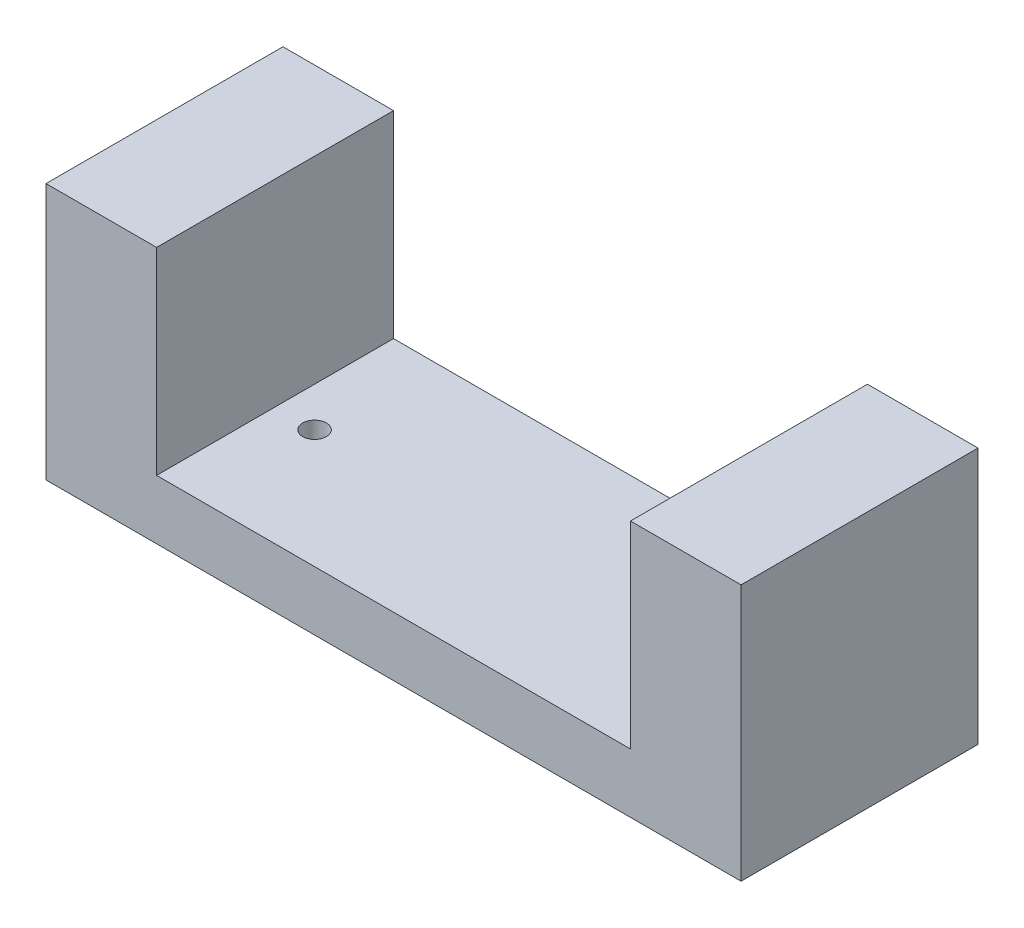
ISO-10303-21;
HEADER;
FILE_DESCRIPTION(('STEP AP214'),'2;1');
FILE_NAME('part.step','',(''),(''),'','','');
FILE_SCHEMA(('AUTOMOTIVE_DESIGN { 1 0 10303 214 1 1 1 1 }'));
ENDSEC;
DATA;
#1=APPLICATION_CONTEXT('core data for automotive mechanical design processes');
#2=APPLICATION_PROTOCOL_DEFINITION('international standard','automotive_design',2000,#1);
#3=PRODUCT_CONTEXT('',#1,'mechanical');
#4=PRODUCT('Part','Part','',(#3));
#5=PRODUCT_RELATED_PRODUCT_CATEGORY('part','',(#4));
#6=PRODUCT_DEFINITION_FORMATION('','',#4);
#7=PRODUCT_DEFINITION_CONTEXT('part definition',#1,'design');
#8=PRODUCT_DEFINITION('design','',#6,#7);
#9=PRODUCT_DEFINITION_SHAPE('','',#8);
#10=(LENGTH_UNIT() NAMED_UNIT(*) SI_UNIT(.MILLI.,.METRE.));
#11=(NAMED_UNIT(*) PLANE_ANGLE_UNIT() SI_UNIT($,.RADIAN.));
#12=(NAMED_UNIT(*) SI_UNIT($,.STERADIAN.) SOLID_ANGLE_UNIT());
#13=UNCERTAINTY_MEASURE_WITH_UNIT(LENGTH_MEASURE(1.E-05),#10,'distance_accuracy_value','');
#14=(GEOMETRIC_REPRESENTATION_CONTEXT(3) GLOBAL_UNCERTAINTY_ASSIGNED_CONTEXT((#13)) GLOBAL_UNIT_ASSIGNED_CONTEXT((#10,
#11,#12)) REPRESENTATION_CONTEXT('',''));
#15=CARTESIAN_POINT('',(0.,0.,0.));
#16=DIRECTION('',(0.,0.,1.));
#17=DIRECTION('',(1.,0.,0.));
#18=AXIS2_PLACEMENT_3D('',#15,#16,#17);
#19=CARTESIAN_POINT('',(0.,32.5,0.));
#20=DIRECTION('',(0.,-1.,0.));
#21=DIRECTION('',(0.,0.,-1.));
#22=AXIS2_PLACEMENT_3D('',#19,#20,#21);
#23=PLANE('',#22);
#24=DIRECTION('',(-1.,0.,0.));
#25=VECTOR('',#24,1.);
#26=CARTESIAN_POINT('',(-44.,32.5,-15.));
#27=LINE('',#26,#25);
#28=CARTESIAN_POINT('',(44.,32.5,-15.));
#29=VERTEX_POINT('',#28);
#30=CARTESIAN_POINT('',(30.,32.5,-15.));
#31=VERTEX_POINT('',#30);
#32=EDGE_CURVE('E89',#29,#31,#27,.T.);
#33=ORIENTED_EDGE('',*,*,#32,.T.);
#34=DIRECTION('',(0.,0.,-1.));
#35=VECTOR('',#34,1.);
#36=CARTESIAN_POINT('',(30.,32.5,15.));
#37=LINE('',#36,#35);
#38=CARTESIAN_POINT('',(30.,32.5,15.));
#39=VERTEX_POINT('',#38);
#40=EDGE_CURVE('E115',#39,#31,#37,.T.);
#41=ORIENTED_EDGE('',*,*,#40,.F.);
#42=DIRECTION('',(1.,0.,0.));
#43=VECTOR('',#42,1.);
#44=CARTESIAN_POINT('',(-44.,32.5,15.));
#45=LINE('',#44,#43);
#46=CARTESIAN_POINT('',(44.,32.5,15.));
#47=VERTEX_POINT('',#46);
#48=EDGE_CURVE('E60',#39,#47,#45,.T.);
#49=ORIENTED_EDGE('',*,*,#48,.T.);
#50=DIRECTION('',(0.,0.,-1.));
#51=VECTOR('',#50,1.);
#52=CARTESIAN_POINT('',(44.,32.5,15.));
#53=LINE('',#52,#51);
#54=EDGE_CURVE('E154',#47,#29,#53,.T.);
#55=ORIENTED_EDGE('',*,*,#54,.T.);
#56=EDGE_LOOP('',(#33,#41,#49,#55));
#57=FACE_BOUND('',#56,.T.);
#58=ADVANCED_FACE('F35',(#57),#23,.F.);
#59=CARTESIAN_POINT('',(44.,32.5,15.));
#60=DIRECTION('',(-1.,0.,0.));
#61=DIRECTION('',(0.,0.,1.));
#62=AXIS2_PLACEMENT_3D('',#59,#60,#61);
#63=PLANE('',#62);
#64=DIRECTION('',(0.,0.,-1.));
#65=VECTOR('',#64,1.);
#66=CARTESIAN_POINT('',(44.,0.,15.));
#67=LINE('',#66,#65);
#68=CARTESIAN_POINT('',(44.,0.,15.));
#69=VERTEX_POINT('',#68);
#70=CARTESIAN_POINT('',(44.,0.,-15.));
#71=VERTEX_POINT('',#70);
#72=EDGE_CURVE('E151',#69,#71,#67,.T.);
#73=ORIENTED_EDGE('',*,*,#72,.T.);
#74=DIRECTION('',(0.,-1.,0.));
#75=VECTOR('',#74,1.);
#76=CARTESIAN_POINT('',(44.,32.5,-15.));
#77=LINE('',#76,#75);
#78=EDGE_CURVE('E11',#29,#71,#77,.T.);
#79=ORIENTED_EDGE('',*,*,#78,.F.);
#80=ORIENTED_EDGE('',*,*,#54,.F.);
#81=DIRECTION('',(0.,-1.,0.));
#82=VECTOR('',#81,1.);
#83=CARTESIAN_POINT('',(44.,32.5,15.));
#84=LINE('',#83,#82);
#85=EDGE_CURVE('E163',#47,#69,#84,.T.);
#86=ORIENTED_EDGE('',*,*,#85,.T.);
#87=EDGE_LOOP('',(#73,#79,#80,#86));
#88=FACE_BOUND('',#87,.T.);
#89=ADVANCED_FACE('F37',(#88),#63,.F.);
#90=CARTESIAN_POINT('',(-44.,32.5,-15.));
#91=DIRECTION('',(0.,0.,1.));
#92=DIRECTION('',(1.,0.,0.));
#93=AXIS2_PLACEMENT_3D('',#90,#91,#92);
#94=PLANE('',#93);
#95=DIRECTION('',(-1.,0.,0.));
#96=VECTOR('',#95,1.);
#97=CARTESIAN_POINT('',(-30.,7.5,-15.));
#98=LINE('',#97,#96);
#99=CARTESIAN_POINT('',(30.,7.5,-15.));
#100=VERTEX_POINT('',#99);
#101=CARTESIAN_POINT('',(-30.,7.5,-15.));
#102=VERTEX_POINT('',#101);
#103=EDGE_CURVE('E124',#100,#102,#98,.T.);
#104=ORIENTED_EDGE('',*,*,#103,.F.);
#105=DIRECTION('',(0.,1.,0.));
#106=VECTOR('',#105,1.);
#107=CARTESIAN_POINT('',(30.,7.5,-15.));
#108=LINE('',#107,#106);
#109=EDGE_CURVE('E110',#100,#31,#108,.T.);
#110=ORIENTED_EDGE('',*,*,#109,.T.);
#111=ORIENTED_EDGE('',*,*,#32,.F.);
#112=ORIENTED_EDGE('',*,*,#78,.T.);
#113=DIRECTION('',(-1.,0.,0.));
#114=VECTOR('',#113,1.);
#115=CARTESIAN_POINT('',(-44.,0.,-15.));
#116=LINE('',#115,#114);
#117=CARTESIAN_POINT('',(-44.,0.,-15.));
#118=VERTEX_POINT('',#117);
#119=EDGE_CURVE('E166',#71,#118,#116,.T.);
#120=ORIENTED_EDGE('',*,*,#119,.T.);
#121=DIRECTION('',(0.,-1.,0.));
#122=VECTOR('',#121,1.);
#123=CARTESIAN_POINT('',(-44.,32.5,-15.));
#124=LINE('',#123,#122);
#125=CARTESIAN_POINT('',(-44.,32.5,-15.));
#126=VERTEX_POINT('',#125);
#127=EDGE_CURVE('E44',#126,#118,#124,.T.);
#128=ORIENTED_EDGE('',*,*,#127,.F.);
#129=CARTESIAN_POINT('',(-30.,32.5,-15.));
#130=VERTEX_POINT('',#129);
#131=EDGE_CURVE('E156',#130,#126,#27,.T.);
#132=ORIENTED_EDGE('',*,*,#131,.F.);
#133=DIRECTION('',(0.,1.,0.));
#134=VECTOR('',#133,1.);
#135=CARTESIAN_POINT('',(-30.,7.5,-15.));
#136=LINE('',#135,#134);
#137=EDGE_CURVE('E51',#102,#130,#136,.T.);
#138=ORIENTED_EDGE('',*,*,#137,.F.);
#139=EDGE_LOOP('',(#104,#110,#111,#112,#120,#128,#132,#138));
#140=FACE_BOUND('',#139,.T.);
#141=ADVANCED_FACE('F129',(#140),#94,.F.);
#142=CARTESIAN_POINT('',(-44.,32.5,15.));
#143=DIRECTION('',(1.,0.,0.));
#144=DIRECTION('',(0.,0.,-1.));
#145=AXIS2_PLACEMENT_3D('',#142,#143,#144);
#146=PLANE('',#145);
#147=DIRECTION('',(0.,0.,1.));
#148=VECTOR('',#147,1.);
#149=CARTESIAN_POINT('',(-44.,0.,15.));
#150=LINE('',#149,#148);
#151=CARTESIAN_POINT('',(-44.,0.,15.));
#152=VERTEX_POINT('',#151);
#153=EDGE_CURVE('E168',#118,#152,#150,.T.);
#154=ORIENTED_EDGE('',*,*,#153,.T.);
#155=DIRECTION('',(0.,-1.,0.));
#156=VECTOR('',#155,1.);
#157=CARTESIAN_POINT('',(-44.,32.5,15.));
#158=LINE('',#157,#156);
#159=CARTESIAN_POINT('',(-44.,32.5,15.));
#160=VERTEX_POINT('',#159);
#161=EDGE_CURVE('E172',#160,#152,#158,.T.);
#162=ORIENTED_EDGE('',*,*,#161,.F.);
#163=DIRECTION('',(0.,0.,1.));
#164=VECTOR('',#163,1.);
#165=CARTESIAN_POINT('',(-44.,32.5,15.));
#166=LINE('',#165,#164);
#167=EDGE_CURVE('E158',#126,#160,#166,.T.);
#168=ORIENTED_EDGE('',*,*,#167,.F.);
#169=ORIENTED_EDGE('',*,*,#127,.T.);
#170=EDGE_LOOP('',(#154,#162,#168,#169));
#171=FACE_BOUND('',#170,.T.);
#172=ADVANCED_FACE('F179',(#171),#146,.F.);
#173=CARTESIAN_POINT('',(-44.,32.5,15.));
#174=DIRECTION('',(0.,0.,-1.));
#175=DIRECTION('',(-1.,0.,0.));
#176=AXIS2_PLACEMENT_3D('',#173,#174,#175);
#177=PLANE('',#176);
#178=ORIENTED_EDGE('',*,*,#48,.F.);
#179=DIRECTION('',(0.,1.,0.));
#180=VECTOR('',#179,1.);
#181=CARTESIAN_POINT('',(30.,7.5,15.));
#182=LINE('',#181,#180);
#183=CARTESIAN_POINT('',(30.,7.5,15.));
#184=VERTEX_POINT('',#183);
#185=EDGE_CURVE('E138',#184,#39,#182,.T.);
#186=ORIENTED_EDGE('',*,*,#185,.F.);
#187=DIRECTION('',(1.,0.,0.));
#188=VECTOR('',#187,1.);
#189=CARTESIAN_POINT('',(-30.,7.5,15.));
#190=LINE('',#189,#188);
#191=CARTESIAN_POINT('',(-30.,7.5,15.));
#192=VERTEX_POINT('',#191);
#193=EDGE_CURVE('E117',#192,#184,#190,.T.);
#194=ORIENTED_EDGE('',*,*,#193,.F.);
#195=DIRECTION('',(0.,1.,0.));
#196=VECTOR('',#195,1.);
#197=CARTESIAN_POINT('',(-30.,7.5,15.));
#198=LINE('',#197,#196);
#199=CARTESIAN_POINT('',(-30.,32.5,15.));
#200=VERTEX_POINT('',#199);
#201=EDGE_CURVE('E140',#192,#200,#198,.T.);
#202=ORIENTED_EDGE('',*,*,#201,.T.);
#203=EDGE_CURVE('E160',#160,#200,#45,.T.);
#204=ORIENTED_EDGE('',*,*,#203,.F.);
#205=ORIENTED_EDGE('',*,*,#161,.T.);
#206=DIRECTION('',(1.,0.,0.));
#207=VECTOR('',#206,1.);
#208=CARTESIAN_POINT('',(-44.,0.,15.));
#209=LINE('',#208,#207);
#210=EDGE_CURVE('E82',#152,#69,#209,.T.);
#211=ORIENTED_EDGE('',*,*,#210,.T.);
#212=ORIENTED_EDGE('',*,*,#85,.F.);
#213=EDGE_LOOP('',(#178,#186,#194,#202,#204,#205,#211,#212));
#214=FACE_BOUND('',#213,.T.);
#215=ADVANCED_FACE('F187',(#214),#177,.F.);
#216=ORIENTED_EDGE('',*,*,#203,.T.);
#217=DIRECTION('',(0.,0.,1.));
#218=VECTOR('',#217,1.);
#219=CARTESIAN_POINT('',(-30.,32.5,15.));
#220=LINE('',#219,#218);
#221=EDGE_CURVE('E127',#130,#200,#220,.T.);
#222=ORIENTED_EDGE('',*,*,#221,.F.);
#223=ORIENTED_EDGE('',*,*,#131,.T.);
#224=ORIENTED_EDGE('',*,*,#167,.T.);
#225=EDGE_LOOP('',(#216,#222,#223,#224));
#226=FACE_BOUND('',#225,.T.);
#227=ADVANCED_FACE('F190',(#226),#23,.F.);
#228=CARTESIAN_POINT('',(0.,0.,0.));
#229=DIRECTION('',(0.,-1.,0.));
#230=DIRECTION('',(0.,0.,-1.));
#231=AXIS2_PLACEMENT_3D('',#228,#229,#230);
#232=PLANE('',#231);
#233=CARTESIAN_POINT('',(-25.,0.,0.));
#234=DIRECTION('',(0.,1.,0.));
#235=DIRECTION('',(0.,0.,1.));
#236=AXIS2_PLACEMENT_3D('',#233,#234,#235);
#237=CIRCLE('',#236,1.5);
#238=CARTESIAN_POINT('',(-25.,0.,1.5));
#239=VERTEX_POINT('',#238);
#240=EDGE_CURVE('E148',#239,#239,#237,.T.);
#241=ORIENTED_EDGE('',*,*,#240,.T.);
#242=EDGE_LOOP('',(#241));
#243=FACE_BOUND('',#242,.T.);
#244=CARTESIAN_POINT('',(25.,0.,0.));
#245=DIRECTION('',(0.,1.,0.));
#246=DIRECTION('',(0.,0.,-1.));
#247=AXIS2_PLACEMENT_3D('',#244,#245,#246);
#248=CIRCLE('',#247,1.5);
#249=CARTESIAN_POINT('',(25.,0.,-1.5));
#250=VERTEX_POINT('',#249);
#251=EDGE_CURVE('E147',#250,#250,#248,.T.);
#252=ORIENTED_EDGE('',*,*,#251,.T.);
#253=EDGE_LOOP('',(#252));
#254=FACE_BOUND('',#253,.T.);
#255=ORIENTED_EDGE('',*,*,#72,.F.);
#256=ORIENTED_EDGE('',*,*,#210,.F.);
#257=ORIENTED_EDGE('',*,*,#153,.F.);
#258=ORIENTED_EDGE('',*,*,#119,.F.);
#259=EDGE_LOOP('',(#255,#256,#257,#258));
#260=FACE_BOUND('',#259,.T.);
#261=ADVANCED_FACE('F183',(#243,#254,#260),#232,.T.);
#262=CARTESIAN_POINT('',(25.,0.,0.));
#263=DIRECTION('',(0.,1.,0.));
#264=DIRECTION('',(0.,0.,1.));
#265=AXIS2_PLACEMENT_3D('',#262,#263,#264);
#266=CYLINDRICAL_SURFACE('',#265,1.5);
#267=CARTESIAN_POINT('',(25.,7.5,0.));
#268=DIRECTION('',(0.,-1.,0.));
#269=DIRECTION('',(0.,0.,-1.));
#270=AXIS2_PLACEMENT_3D('',#267,#268,#269);
#271=CIRCLE('',#270,1.5);
#272=CARTESIAN_POINT('',(25.,7.5,-1.5));
#273=VERTEX_POINT('',#272);
#274=EDGE_CURVE('E144',#273,#273,#271,.F.);
#275=ORIENTED_EDGE('',*,*,#274,.T.);
#276=EDGE_LOOP('',(#275));
#277=FACE_BOUND('',#276,.T.);
#278=ORIENTED_EDGE('',*,*,#251,.F.);
#279=EDGE_LOOP('',(#278));
#280=FACE_BOUND('',#279,.T.);
#281=ADVANCED_FACE('F202',(#277,#280),#266,.F.);
#282=CARTESIAN_POINT('',(-25.,0.,0.));
#283=DIRECTION('',(0.,1.,0.));
#284=DIRECTION('',(0.,0.,1.));
#285=AXIS2_PLACEMENT_3D('',#282,#283,#284);
#286=CYLINDRICAL_SURFACE('',#285,1.5);
#287=CARTESIAN_POINT('',(-25.,7.5,0.));
#288=DIRECTION('',(0.,-1.,0.));
#289=DIRECTION('',(0.,0.,-1.));
#290=AXIS2_PLACEMENT_3D('',#287,#288,#289);
#291=CIRCLE('',#290,1.5);
#292=CARTESIAN_POINT('',(-25.,7.5,-1.5));
#293=VERTEX_POINT('',#292);
#294=EDGE_CURVE('E39',#293,#293,#291,.F.);
#295=ORIENTED_EDGE('',*,*,#294,.T.);
#296=EDGE_LOOP('',(#295));
#297=FACE_BOUND('',#296,.T.);
#298=ORIENTED_EDGE('',*,*,#240,.F.);
#299=EDGE_LOOP('',(#298));
#300=FACE_BOUND('',#299,.T.);
#301=ADVANCED_FACE('F215',(#297,#300),#286,.F.);
#302=CARTESIAN_POINT('',(0.,7.5,0.));
#303=DIRECTION('',(0.,-1.,0.));
#304=DIRECTION('',(0.,0.,-1.));
#305=AXIS2_PLACEMENT_3D('',#302,#303,#304);
#306=PLANE('',#305);
#307=ORIENTED_EDGE('',*,*,#294,.F.);
#308=EDGE_LOOP('',(#307));
#309=FACE_BOUND('',#308,.T.);
#310=DIRECTION('',(0.,0.,-1.));
#311=VECTOR('',#310,1.);
#312=CARTESIAN_POINT('',(30.,7.5,15.));
#313=LINE('',#312,#311);
#314=EDGE_CURVE('E113',#184,#100,#313,.T.);
#315=ORIENTED_EDGE('',*,*,#314,.T.);
#316=ORIENTED_EDGE('',*,*,#103,.T.);
#317=DIRECTION('',(0.,0.,1.));
#318=VECTOR('',#317,1.);
#319=CARTESIAN_POINT('',(-30.,7.5,15.));
#320=LINE('',#319,#318);
#321=EDGE_CURVE('E131',#102,#192,#320,.T.);
#322=ORIENTED_EDGE('',*,*,#321,.T.);
#323=ORIENTED_EDGE('',*,*,#193,.T.);
#324=EDGE_LOOP('',(#315,#316,#322,#323));
#325=FACE_BOUND('',#324,.T.);
#326=ORIENTED_EDGE('',*,*,#274,.F.);
#327=EDGE_LOOP('',(#326));
#328=FACE_BOUND('',#327,.T.);
#329=ADVANCED_FACE('F121',(#309,#325,#328),#306,.F.);
#330=CARTESIAN_POINT('',(30.,7.5,15.));
#331=DIRECTION('',(1.,0.,0.));
#332=DIRECTION('',(0.,0.,-1.));
#333=AXIS2_PLACEMENT_3D('',#330,#331,#332);
#334=PLANE('',#333);
#335=ORIENTED_EDGE('',*,*,#40,.T.);
#336=ORIENTED_EDGE('',*,*,#109,.F.);
#337=ORIENTED_EDGE('',*,*,#314,.F.);
#338=ORIENTED_EDGE('',*,*,#185,.T.);
#339=EDGE_LOOP('',(#335,#336,#337,#338));
#340=FACE_BOUND('',#339,.T.);
#341=ADVANCED_FACE('F112',(#340),#334,.F.);
#342=CARTESIAN_POINT('',(-30.,7.5,15.));
#343=DIRECTION('',(-1.,0.,0.));
#344=DIRECTION('',(0.,0.,1.));
#345=AXIS2_PLACEMENT_3D('',#342,#343,#344);
#346=PLANE('',#345);
#347=ORIENTED_EDGE('',*,*,#221,.T.);
#348=ORIENTED_EDGE('',*,*,#201,.F.);
#349=ORIENTED_EDGE('',*,*,#321,.F.);
#350=ORIENTED_EDGE('',*,*,#137,.T.);
#351=EDGE_LOOP('',(#347,#348,#349,#350));
#352=FACE_BOUND('',#351,.T.);
#353=ADVANCED_FACE('F206',(#352),#346,.F.);
#354=CLOSED_SHELL('',(#58,#89,#141,#172,#215,#227,#261,#281,#301,#329,#341,#353));
#355=MANIFOLD_SOLID_BREP('B2',#354);
#356=ADVANCED_BREP_SHAPE_REPRESENTATION('',(#18,#355),#14);
#357=SHAPE_DEFINITION_REPRESENTATION(#9,#356);
ENDSEC;
END-ISO-10303-21;
